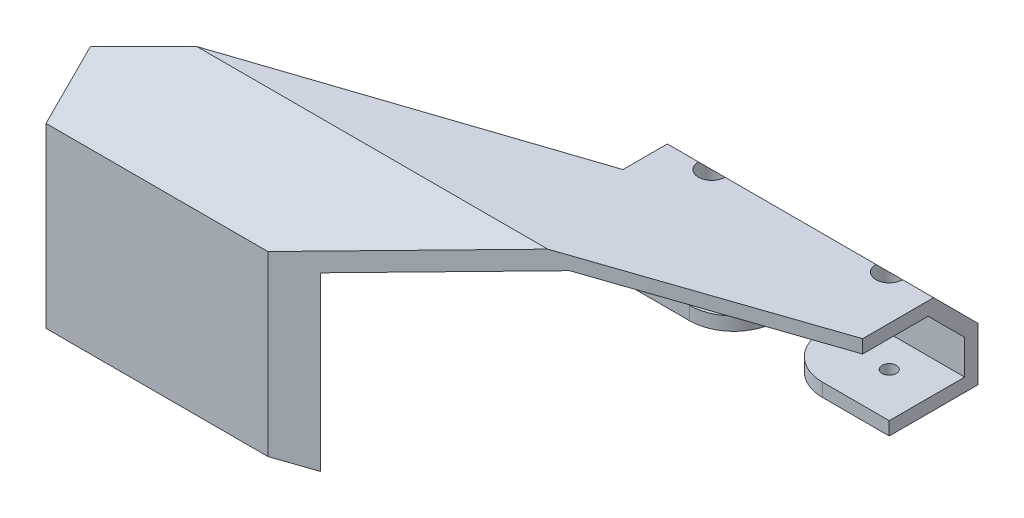
ISO-10303-21;
HEADER;
FILE_DESCRIPTION(('STEP AP214'),'2;1');
FILE_NAME('part.step','',(''),(''),'','','');
FILE_SCHEMA(('AUTOMOTIVE_DESIGN { 1 0 10303 214 1 1 1 1 }'));
ENDSEC;
DATA;
#1=APPLICATION_CONTEXT('core data for automotive mechanical design processes');
#2=APPLICATION_PROTOCOL_DEFINITION('international standard','automotive_design',2000,#1);
#3=PRODUCT_CONTEXT('',#1,'mechanical');
#4=PRODUCT('Part','Part','',(#3));
#5=PRODUCT_RELATED_PRODUCT_CATEGORY('part','',(#4));
#6=PRODUCT_DEFINITION_FORMATION('','',#4);
#7=PRODUCT_DEFINITION_CONTEXT('part definition',#1,'design');
#8=PRODUCT_DEFINITION('design','',#6,#7);
#9=PRODUCT_DEFINITION_SHAPE('','',#8);
#10=(LENGTH_UNIT() NAMED_UNIT(*) SI_UNIT(.MILLI.,.METRE.));
#11=(NAMED_UNIT(*) PLANE_ANGLE_UNIT() SI_UNIT($,.RADIAN.));
#12=(NAMED_UNIT(*) SI_UNIT($,.STERADIAN.) SOLID_ANGLE_UNIT());
#13=UNCERTAINTY_MEASURE_WITH_UNIT(LENGTH_MEASURE(1.E-05),#10,'distance_accuracy_value','');
#14=(GEOMETRIC_REPRESENTATION_CONTEXT(3) GLOBAL_UNCERTAINTY_ASSIGNED_CONTEXT((#13)) GLOBAL_UNIT_ASSIGNED_CONTEXT((#10,
#11,#12)) REPRESENTATION_CONTEXT('',''));
#15=CARTESIAN_POINT('',(0.,0.,0.));
#16=DIRECTION('',(0.,0.,1.));
#17=DIRECTION('',(1.,0.,0.));
#18=AXIS2_PLACEMENT_3D('',#15,#16,#17);
#19=CARTESIAN_POINT('',(-150.,3.,20.));
#20=DIRECTION('',(0.,0.,1.));
#21=DIRECTION('',(-1.,0.,0.));
#22=AXIS2_PLACEMENT_3D('',#19,#20,#21);
#23=PLANE('',#22);
#24=DIRECTION('',(1.,0.,0.));
#25=VECTOR('',#24,1.);
#26=CARTESIAN_POINT('',(-150.,3.,20.));
#27=LINE('',#26,#25);
#28=CARTESIAN_POINT('',(-60.,3.,20.));
#29=VERTEX_POINT('',#28);
#30=CARTESIAN_POINT('',(-45.,3.,20.));
#31=VERTEX_POINT('',#30);
#32=EDGE_CURVE('E386',#29,#31,#27,.T.);
#33=ORIENTED_EDGE('',*,*,#32,.F.);
#34=DIRECTION('',(0.,-1.,0.));
#35=VECTOR('',#34,1.);
#36=CARTESIAN_POINT('',(-60.,22.,20.));
#37=LINE('',#36,#35);
#38=CARTESIAN_POINT('',(-60.,0.,20.));
#39=VERTEX_POINT('',#38);
#40=EDGE_CURVE('E259',#29,#39,#37,.T.);
#41=ORIENTED_EDGE('',*,*,#40,.T.);
#42=DIRECTION('',(1.,0.,0.));
#43=VECTOR('',#42,1.);
#44=CARTESIAN_POINT('',(-150.,0.,20.));
#45=LINE('',#44,#43);
#46=CARTESIAN_POINT('',(-45.,0.,20.));
#47=VERTEX_POINT('',#46);
#48=EDGE_CURVE('E341',#39,#47,#45,.T.);
#49=ORIENTED_EDGE('',*,*,#48,.T.);
#50=DIRECTION('',(0.,-1.,0.));
#51=VECTOR('',#50,1.);
#52=CARTESIAN_POINT('',(-45.,0.,20.));
#53=LINE('',#52,#51);
#54=EDGE_CURVE('E391',#31,#47,#53,.T.);
#55=ORIENTED_EDGE('',*,*,#54,.F.);
#56=EDGE_LOOP('',(#33,#41,#49,#55));
#57=FACE_BOUND('',#56,.T.);
#58=ADVANCED_FACE('F35',(#57),#23,.T.);
#59=CARTESIAN_POINT('',(-150.,12.,0.));
#60=DIRECTION('',(0.,0.707106781186548,-0.707106781186548));
#61=DIRECTION('',(0.,-0.707106781186548,-0.707106781186548));
#62=AXIS2_PLACEMENT_3D('',#59,#60,#61);
#63=PLANE('',#62);
#64=DIRECTION('',(1.,0.,0.));
#65=VECTOR('',#64,1.);
#66=CARTESIAN_POINT('',(-150.,22.,10.));
#67=LINE('',#66,#65);
#68=CARTESIAN_POINT('',(-7.,22.,10.));
#69=VERTEX_POINT('',#68);
#70=CARTESIAN_POINT('',(0.,22.,10.));
#71=VERTEX_POINT('',#70);
#72=EDGE_CURVE('E356',#69,#71,#67,.T.);
#73=ORIENTED_EDGE('',*,*,#72,.T.);
#74=DIRECTION('',(0.,-0.707106781186548,-0.707106781186548));
#75=VECTOR('',#74,1.);
#76=CARTESIAN_POINT('',(0.,12.,0.));
#77=LINE('',#76,#75);
#78=CARTESIAN_POINT('',(0.,12.,0.));
#79=VERTEX_POINT('',#78);
#80=EDGE_CURVE('E335',#71,#79,#77,.T.);
#81=ORIENTED_EDGE('',*,*,#80,.T.);
#82=DIRECTION('',(1.,0.,0.));
#83=VECTOR('',#82,1.);
#84=CARTESIAN_POINT('',(-150.,12.,0.));
#85=LINE('',#84,#83);
#86=CARTESIAN_POINT('',(-60.,12.,0.));
#87=VERTEX_POINT('',#86);
#88=EDGE_CURVE('E349',#87,#79,#85,.T.);
#89=ORIENTED_EDGE('',*,*,#88,.F.);
#90=DIRECTION('',(0.,-0.707106781186548,-0.707106781186548));
#91=VECTOR('',#90,1.);
#92=CARTESIAN_POINT('',(-60.,12.,0.));
#93=LINE('',#92,#91);
#94=CARTESIAN_POINT('',(-60.,22.,10.));
#95=VERTEX_POINT('',#94);
#96=EDGE_CURVE('E278',#95,#87,#93,.T.);
#97=ORIENTED_EDGE('',*,*,#96,.F.);
#98=CARTESIAN_POINT('',(-53.,22.,10.));
#99=VERTEX_POINT('',#98);
#100=EDGE_CURVE('E352',#95,#99,#67,.T.);
#101=ORIENTED_EDGE('',*,*,#100,.T.);
#102=CARTESIAN_POINT('',(-50.,22.,10.));
#103=DIRECTION('',(0.,-0.707106781186548,0.707106781186548));
#104=DIRECTION('',(0.,-0.707106781186548,-0.707106781186548));
#105=AXIS2_PLACEMENT_3D('',#102,#103,#104);
#106=ELLIPSE('',#105,4.24264068711929,3.);
#107=CARTESIAN_POINT('',(-47.,22.,10.));
#108=VERTEX_POINT('',#107);
#109=EDGE_CURVE('E238',#108,#99,#106,.F.);
#110=ORIENTED_EDGE('',*,*,#109,.F.);
#111=CARTESIAN_POINT('',(-13.,22.,10.));
#112=VERTEX_POINT('',#111);
#113=EDGE_CURVE('E355',#108,#112,#67,.T.);
#114=ORIENTED_EDGE('',*,*,#113,.T.);
#115=CARTESIAN_POINT('',(-10.,22.,9.99999999999999));
#116=DIRECTION('',(0.,-0.707106781186548,0.707106781186548));
#117=DIRECTION('',(0.,-0.707106781186548,-0.707106781186548));
#118=AXIS2_PLACEMENT_3D('',#115,#116,#117);
#119=ELLIPSE('',#118,4.24264068711928,3.);
#120=EDGE_CURVE('E228',#69,#112,#119,.F.);
#121=ORIENTED_EDGE('',*,*,#120,.F.);
#122=EDGE_LOOP('',(#73,#81,#89,#97,#101,#110,#114,#121));
#123=FACE_BOUND('',#122,.T.);
#124=ADVANCED_FACE('F464',(#123),#63,.T.);
#125=CARTESIAN_POINT('',(-150.,22.,10.));
#126=DIRECTION('',(0.,1.,0.));
#127=DIRECTION('',(0.,0.,-1.));
#128=AXIS2_PLACEMENT_3D('',#125,#126,#127);
#129=PLANE('',#128);
#130=ORIENTED_EDGE('',*,*,#113,.F.);
#131=CARTESIAN_POINT('',(-50.,22.,10.));
#132=DIRECTION('',(0.,-1.,0.));
#133=DIRECTION('',(0.,0.,-1.));
#134=AXIS2_PLACEMENT_3D('',#131,#132,#133);
#135=CIRCLE('',#134,3.);
#136=EDGE_CURVE('E231',#108,#99,#135,.T.);
#137=ORIENTED_EDGE('',*,*,#136,.T.);
#138=ORIENTED_EDGE('',*,*,#100,.F.);
#139=DIRECTION('',(0.,0.,1.));
#140=VECTOR('',#139,1.);
#141=CARTESIAN_POINT('',(-60.,22.,0.));
#142=LINE('',#141,#140);
#143=CARTESIAN_POINT('',(-60.,22.,20.));
#144=VERTEX_POINT('',#143);
#145=EDGE_CURVE('E251',#95,#144,#142,.T.);
#146=ORIENTED_EDGE('',*,*,#145,.T.);
#147=DIRECTION('',(-0.948683298050514,0.,0.316227766016838));
#148=VECTOR('',#147,1.);
#149=CARTESIAN_POINT('',(-60.,22.,20.));
#150=LINE('',#149,#148);
#151=CARTESIAN_POINT('',(-132.,22.,44.));
#152=VERTEX_POINT('',#151);
#153=EDGE_CURVE('E256',#144,#152,#150,.T.);
#154=ORIENTED_EDGE('',*,*,#153,.T.);
#155=DIRECTION('',(1.,0.,0.));
#156=VECTOR('',#155,1.);
#157=CARTESIAN_POINT('',(-150.,22.,44.));
#158=LINE('',#157,#156);
#159=CARTESIAN_POINT('',(-52.9411764705882,22.,44.));
#160=VERTEX_POINT('',#159);
#161=EDGE_CURVE('E357',#152,#160,#158,.T.);
#162=ORIENTED_EDGE('',*,*,#161,.T.);
#163=DIRECTION('',(0.946772744819713,0.,-0.321902733238702));
#164=VECTOR('',#163,1.);
#165=CARTESIAN_POINT('',(-100.,22.,60.));
#166=LINE('',#165,#164);
#167=CARTESIAN_POINT('',(0.,22.,26.));
#168=VERTEX_POINT('',#167);
#169=EDGE_CURVE('E286',#160,#168,#166,.T.);
#170=ORIENTED_EDGE('',*,*,#169,.T.);
#171=DIRECTION('',(0.,0.,-1.));
#172=VECTOR('',#171,1.);
#173=CARTESIAN_POINT('',(0.,22.,10.));
#174=LINE('',#173,#172);
#175=EDGE_CURVE('E333',#168,#71,#174,.T.);
#176=ORIENTED_EDGE('',*,*,#175,.T.);
#177=ORIENTED_EDGE('',*,*,#72,.F.);
#178=CARTESIAN_POINT('',(-10.,22.,9.99999999999999));
#179=DIRECTION('',(0.,-1.,0.));
#180=DIRECTION('',(0.,0.,-1.));
#181=AXIS2_PLACEMENT_3D('',#178,#179,#180);
#182=CIRCLE('',#181,3.);
#183=EDGE_CURVE('E208',#69,#112,#182,.T.);
#184=ORIENTED_EDGE('',*,*,#183,.T.);
#185=EDGE_LOOP('',(#130,#137,#138,#146,#154,#162,#170,#176,#177,#184));
#186=FACE_BOUND('',#185,.T.);
#187=ADVANCED_FACE('F458',(#186),#129,.T.);
#188=CARTESIAN_POINT('',(-150.,22.,44.));
#189=DIRECTION('',(0.,0.707106781186548,0.707106781186548));
#190=DIRECTION('',(0.,0.707106781186548,-0.707106781186548));
#191=AXIS2_PLACEMENT_3D('',#188,#189,#190);
#192=PLANE('',#191);
#193=DIRECTION('',(0.,0.707106781186548,-0.707106781186548));
#194=VECTOR('',#193,1.);
#195=CARTESIAN_POINT('',(-150.,22.,44.));
#196=LINE('',#195,#194);
#197=CARTESIAN_POINT('',(-150.,6.,60.));
#198=VERTEX_POINT('',#197);
#199=CARTESIAN_POINT('',(-150.,16.,50.));
#200=VERTEX_POINT('',#199);
#201=EDGE_CURVE('E318',#198,#200,#196,.T.);
#202=ORIENTED_EDGE('',*,*,#201,.F.);
#203=DIRECTION('',(1.,0.,0.));
#204=VECTOR('',#203,1.);
#205=CARTESIAN_POINT('',(-150.,6.,60.));
#206=LINE('',#205,#204);
#207=CARTESIAN_POINT('',(-100.,6.,60.));
#208=VERTEX_POINT('',#207);
#209=EDGE_CURVE('E360',#198,#208,#206,.T.);
#210=ORIENTED_EDGE('',*,*,#209,.T.);
#211=DIRECTION('',(-0.901230117393125,-0.306418239913663,0.306418239913663));
#212=VECTOR('',#211,1.);
#213=CARTESIAN_POINT('',(-131.7738791423,-4.80311890838207,70.8031189083821));
#214=LINE('',#213,#212);
#215=EDGE_CURVE('E302',#160,#208,#214,.T.);
#216=ORIENTED_EDGE('',*,*,#215,.F.);
#217=ORIENTED_EDGE('',*,*,#161,.F.);
#218=DIRECTION('',(0.904534033733291,0.301511344577764,-0.301511344577764));
#219=VECTOR('',#218,1.);
#220=CARTESIAN_POINT('',(-146.727272727273,17.0909090909091,48.9090909090909));
#221=LINE('',#220,#219);
#222=EDGE_CURVE('E269',#200,#152,#221,.T.);
#223=ORIENTED_EDGE('',*,*,#222,.F.);
#224=EDGE_LOOP('',(#202,#210,#216,#217,#223));
#225=FACE_BOUND('',#224,.T.);
#226=ADVANCED_FACE('F454',(#225),#192,.T.);
#227=CARTESIAN_POINT('',(-150.,19.,42.7573593128807));
#228=DIRECTION('',(0.,-0.707106781186547,-0.707106781186548));
#229=DIRECTION('',(0.,-0.707106781186548,0.707106781186547));
#230=AXIS2_PLACEMENT_3D('',#227,#228,#229);
#231=PLANE('',#230);
#232=DIRECTION('',(1.,0.,0.));
#233=VECTOR('',#232,1.);
#234=CARTESIAN_POINT('',(-150.,19.,42.7573593128807));
#235=LINE('',#234,#233);
#236=CARTESIAN_POINT('',(-128.272077938642,19.,42.7573593128807));
#237=VERTEX_POINT('',#236);
#238=CARTESIAN_POINT('',(-49.2863509202374,19.,42.7573593128807));
#239=VERTEX_POINT('',#238);
#240=EDGE_CURVE('E372',#237,#239,#235,.T.);
#241=ORIENTED_EDGE('',*,*,#240,.T.);
#242=DIRECTION('',(0.901230117393125,0.306418239913663,-0.306418239913663));
#243=VECTOR('',#242,1.);
#244=CARTESIAN_POINT('',(-131.087560374236,-8.8124112143594,70.5697705272401));
#245=LINE('',#244,#243);
#246=CARTESIAN_POINT('',(-91.1764705882353,4.75735931288072,57.));
#247=VERTEX_POINT('',#246);
#248=EDGE_CURVE('E297',#247,#239,#245,.T.);
#249=ORIENTED_EDGE('',*,*,#248,.F.);
#250=DIRECTION('',(1.,0.,0.));
#251=VECTOR('',#250,1.);
#252=CARTESIAN_POINT('',(-150.,4.75735931288072,57.));
#253=LINE('',#252,#251);
#254=CARTESIAN_POINT('',(-150.,4.75735931288072,57.));
#255=VERTEX_POINT('',#254);
#256=EDGE_CURVE('E369',#255,#247,#253,.T.);
#257=ORIENTED_EDGE('',*,*,#256,.F.);
#258=DIRECTION('',(0.,-0.707106781186548,0.707106781186547));
#259=VECTOR('',#258,1.);
#260=CARTESIAN_POINT('',(-150.,19.,42.7573593128807));
#261=LINE('',#260,#259);
#262=CARTESIAN_POINT('',(-150.,11.7573593128807,50.));
#263=VERTEX_POINT('',#262);
#264=EDGE_CURVE('E306',#263,#255,#261,.T.);
#265=ORIENTED_EDGE('',*,*,#264,.F.);
#266=DIRECTION('',(-0.904534033733291,-0.301511344577764,0.301511344577764));
#267=VECTOR('',#266,1.);
#268=CARTESIAN_POINT('',(-146.049468716117,13.0742030741751,48.6831562387056));
#269=LINE('',#268,#267);
#270=EDGE_CURVE('E266',#237,#263,#269,.T.);
#271=ORIENTED_EDGE('',*,*,#270,.F.);
#272=EDGE_LOOP('',(#241,#249,#257,#265,#271));
#273=FACE_BOUND('',#272,.T.);
#274=ADVANCED_FACE('F445',(#273),#231,.T.);
#275=CARTESIAN_POINT('',(-150.,19.,11.2426406871193));
#276=DIRECTION('',(0.,-1.,0.));
#277=DIRECTION('',(0.,0.,1.));
#278=AXIS2_PLACEMENT_3D('',#275,#276,#277);
#279=PLANE('',#278);
#280=DIRECTION('',(1.,0.,0.));
#281=VECTOR('',#280,1.);
#282=CARTESIAN_POINT('',(-150.,19.,11.2426406871193));
#283=LINE('',#282,#281);
#284=CARTESIAN_POINT('',(-7.26946083662663,19.,11.2426406871193));
#285=VERTEX_POINT('',#284);
#286=CARTESIAN_POINT('',(0.,19.,11.2426406871193));
#287=VERTEX_POINT('',#286);
#288=EDGE_CURVE('E379',#285,#287,#283,.T.);
#289=ORIENTED_EDGE('',*,*,#288,.T.);
#290=DIRECTION('',(0.,0.,1.));
#291=VECTOR('',#290,1.);
#292=CARTESIAN_POINT('',(0.,19.,11.2426406871193));
#293=LINE('',#292,#291);
#294=CARTESIAN_POINT('',(0.,19.,26.));
#295=VERTEX_POINT('',#294);
#296=EDGE_CURVE('E330',#287,#295,#293,.T.);
#297=ORIENTED_EDGE('',*,*,#296,.T.);
#298=DIRECTION('',(0.946772744819713,0.,-0.321902733238702));
#299=VECTOR('',#298,1.);
#300=CARTESIAN_POINT('',(-129.959212830424,19.,70.186132362344));
#301=LINE('',#300,#299);
#302=EDGE_CURVE('E294',#239,#295,#301,.T.);
#303=ORIENTED_EDGE('',*,*,#302,.F.);
#304=ORIENTED_EDGE('',*,*,#240,.F.);
#305=DIRECTION('',(-0.948683298050514,0.,0.316227766016838));
#306=VECTOR('',#305,1.);
#307=CARTESIAN_POINT('',(-138.372792206136,19.,46.1242640687119));
#308=LINE('',#307,#306);
#309=CARTESIAN_POINT('',(-60.,19.,20.));
#310=VERTEX_POINT('',#309);
#311=EDGE_CURVE('E264',#310,#237,#308,.T.);
#312=ORIENTED_EDGE('',*,*,#311,.F.);
#313=DIRECTION('',(0.,0.,1.));
#314=VECTOR('',#313,1.);
#315=CARTESIAN_POINT('',(-60.,19.,11.2426406871193));
#316=LINE('',#315,#314);
#317=CARTESIAN_POINT('',(-60.,19.,11.2426406871193));
#318=VERTEX_POINT('',#317);
#319=EDGE_CURVE('E275',#318,#310,#316,.T.);
#320=ORIENTED_EDGE('',*,*,#319,.F.);
#321=CARTESIAN_POINT('',(-52.7305391633734,19.,11.2426406871193));
#322=VERTEX_POINT('',#321);
#323=EDGE_CURVE('E375',#318,#322,#283,.T.);
#324=ORIENTED_EDGE('',*,*,#323,.T.);
#325=CARTESIAN_POINT('',(-50.,19.,10.));
#326=DIRECTION('',(0.,1.,0.));
#327=DIRECTION('',(0.,0.,1.));
#328=AXIS2_PLACEMENT_3D('',#325,#326,#327);
#329=CIRCLE('',#328,3.);
#330=CARTESIAN_POINT('',(-47.2694608366266,19.,11.2426406871193));
#331=VERTEX_POINT('',#330);
#332=EDGE_CURVE('E235',#331,#322,#329,.F.);
#333=ORIENTED_EDGE('',*,*,#332,.F.);
#334=CARTESIAN_POINT('',(-12.7305391633734,19.,11.2426406871193));
#335=VERTEX_POINT('',#334);
#336=EDGE_CURVE('E378',#331,#335,#283,.T.);
#337=ORIENTED_EDGE('',*,*,#336,.T.);
#338=CARTESIAN_POINT('',(-10.,19.,9.99999999999999));
#339=DIRECTION('',(0.,1.,0.));
#340=DIRECTION('',(0.,0.,1.));
#341=AXIS2_PLACEMENT_3D('',#338,#339,#340);
#342=CIRCLE('',#341,3.);
#343=EDGE_CURVE('E225',#285,#335,#342,.F.);
#344=ORIENTED_EDGE('',*,*,#343,.F.);
#345=EDGE_LOOP('',(#289,#297,#303,#304,#312,#320,#324,#333,#337,#344));
#346=FACE_BOUND('',#345,.T.);
#347=ADVANCED_FACE('F437',(#346),#279,.T.);
#348=CARTESIAN_POINT('',(-15.,0.,20.));
#349=VERTEX_POINT('',#348);
#350=CARTESIAN_POINT('',(0.,0.,20.));
#351=VERTEX_POINT('',#350);
#352=EDGE_CURVE('E345',#349,#351,#45,.T.);
#353=ORIENTED_EDGE('',*,*,#352,.T.);
#354=DIRECTION('',(0.,1.,0.));
#355=VECTOR('',#354,1.);
#356=CARTESIAN_POINT('',(0.,3.,20.));
#357=LINE('',#356,#355);
#358=CARTESIAN_POINT('',(0.,3.,20.));
#359=VERTEX_POINT('',#358);
#360=EDGE_CURVE('E305',#351,#359,#357,.T.);
#361=ORIENTED_EDGE('',*,*,#360,.T.);
#362=CARTESIAN_POINT('',(-15.,3.,20.));
#363=VERTEX_POINT('',#362);
#364=EDGE_CURVE('E321',#363,#359,#27,.T.);
#365=ORIENTED_EDGE('',*,*,#364,.F.);
#366=DIRECTION('',(0.,-1.,0.));
#367=VECTOR('',#366,1.);
#368=CARTESIAN_POINT('',(-15.,3.,20.));
#369=LINE('',#368,#367);
#370=EDGE_CURVE('E11',#349,#363,#369,.F.);
#371=ORIENTED_EDGE('',*,*,#370,.F.);
#372=EDGE_LOOP('',(#353,#361,#365,#371));
#373=FACE_BOUND('',#372,.T.);
#374=ADVANCED_FACE('F418',(#373),#23,.T.);
#375=CARTESIAN_POINT('',(-150.,0.,20.));
#376=DIRECTION('',(0.,-1.,0.));
#377=DIRECTION('',(0.,0.,1.));
#378=AXIS2_PLACEMENT_3D('',#375,#376,#377);
#379=PLANE('',#378);
#380=ORIENTED_EDGE('',*,*,#48,.F.);
#381=DIRECTION('',(0.,0.,1.));
#382=VECTOR('',#381,1.);
#383=CARTESIAN_POINT('',(-60.,0.,20.));
#384=LINE('',#383,#382);
#385=CARTESIAN_POINT('',(-60.,0.,0.));
#386=VERTEX_POINT('',#385);
#387=EDGE_CURVE('E281',#386,#39,#384,.T.);
#388=ORIENTED_EDGE('',*,*,#387,.F.);
#389=DIRECTION('',(1.,0.,0.));
#390=VECTOR('',#389,1.);
#391=CARTESIAN_POINT('',(-150.,0.,0.));
#392=LINE('',#391,#390);
#393=CARTESIAN_POINT('',(0.,0.,0.));
#394=VERTEX_POINT('',#393);
#395=EDGE_CURVE('E346',#386,#394,#392,.T.);
#396=ORIENTED_EDGE('',*,*,#395,.T.);
#397=DIRECTION('',(0.,0.,1.));
#398=VECTOR('',#397,1.);
#399=CARTESIAN_POINT('',(0.,0.,20.));
#400=LINE('',#399,#398);
#401=EDGE_CURVE('E310',#394,#351,#400,.T.);
#402=ORIENTED_EDGE('',*,*,#401,.T.);
#403=ORIENTED_EDGE('',*,*,#352,.F.);
#404=CARTESIAN_POINT('',(-15.,0.,10.));
#405=DIRECTION('',(0.,1.,0.));
#406=DIRECTION('',(0.,0.,1.));
#407=AXIS2_PLACEMENT_3D('',#404,#405,#406);
#408=CIRCLE('',#407,10.);
#409=CARTESIAN_POINT('',(-25.,0.,10.));
#410=VERTEX_POINT('',#409);
#411=EDGE_CURVE('E56',#410,#349,#408,.T.);
#412=ORIENTED_EDGE('',*,*,#411,.F.);
#413=CARTESIAN_POINT('',(-30.,0.,10.));
#414=DIRECTION('',(0.,1.,0.));
#415=DIRECTION('',(0.,0.,1.));
#416=AXIS2_PLACEMENT_3D('',#413,#414,#415);
#417=CIRCLE('',#416,5.);
#418=CARTESIAN_POINT('',(-35.,0.,10.));
#419=VERTEX_POINT('',#418);
#420=EDGE_CURVE('E207',#410,#419,#417,.T.);
#421=ORIENTED_EDGE('',*,*,#420,.T.);
#422=CARTESIAN_POINT('',(-45.,0.,10.));
#423=DIRECTION('',(0.,1.,0.));
#424=DIRECTION('',(0.,0.,1.));
#425=AXIS2_PLACEMENT_3D('',#422,#423,#424);
#426=CIRCLE('',#425,10.);
#427=EDGE_CURVE('E212',#47,#419,#426,.T.);
#428=ORIENTED_EDGE('',*,*,#427,.F.);
#429=EDGE_LOOP('',(#380,#388,#396,#402,#403,#412,#421,#428));
#430=FACE_BOUND('',#429,.T.);
#431=CARTESIAN_POINT('',(-10.,0.,9.99999999999999));
#432=DIRECTION('',(0.,1.,0.));
#433=DIRECTION('',(0.,0.,1.));
#434=AXIS2_PLACEMENT_3D('',#431,#432,#433);
#435=CIRCLE('',#434,1.6);
#436=CARTESIAN_POINT('',(-10.,0.,11.6));
#437=VERTEX_POINT('',#436);
#438=EDGE_CURVE('E242',#437,#437,#435,.T.);
#439=ORIENTED_EDGE('',*,*,#438,.T.);
#440=EDGE_LOOP('',(#439));
#441=FACE_BOUND('',#440,.T.);
#442=CARTESIAN_POINT('',(-50.,0.,10.));
#443=DIRECTION('',(0.,1.,0.));
#444=DIRECTION('',(0.,0.,1.));
#445=AXIS2_PLACEMENT_3D('',#442,#443,#444);
#446=CIRCLE('',#445,1.6);
#447=CARTESIAN_POINT('',(-50.,0.,11.6));
#448=VERTEX_POINT('',#447);
#449=EDGE_CURVE('E248',#448,#448,#446,.T.);
#450=ORIENTED_EDGE('',*,*,#449,.T.);
#451=EDGE_LOOP('',(#450));
#452=FACE_BOUND('',#451,.T.);
#453=ADVANCED_FACE('F411',(#430,#441,#452),#379,.T.);
#454=CARTESIAN_POINT('',(-150.,0.,0.));
#455=DIRECTION('',(0.,0.,-1.));
#456=DIRECTION('',(1.,0.,0.));
#457=AXIS2_PLACEMENT_3D('',#454,#455,#456);
#458=PLANE('',#457);
#459=ORIENTED_EDGE('',*,*,#88,.T.);
#460=DIRECTION('',(0.,-1.,0.));
#461=VECTOR('',#460,1.);
#462=CARTESIAN_POINT('',(0.,0.,0.));
#463=LINE('',#462,#461);
#464=EDGE_CURVE('E338',#79,#394,#463,.T.);
#465=ORIENTED_EDGE('',*,*,#464,.T.);
#466=ORIENTED_EDGE('',*,*,#395,.F.);
#467=DIRECTION('',(0.,-1.,0.));
#468=VECTOR('',#467,1.);
#469=CARTESIAN_POINT('',(-60.,22.,0.));
#470=LINE('',#469,#468);
#471=EDGE_CURVE('E262',#87,#386,#470,.T.);
#472=ORIENTED_EDGE('',*,*,#471,.F.);
#473=EDGE_LOOP('',(#459,#465,#466,#472));
#474=FACE_BOUND('',#473,.T.);
#475=ADVANCED_FACE('F467',(#474),#458,.T.);
#476=CARTESIAN_POINT('',(-150.,10.7573593128807,3.));
#477=DIRECTION('',(0.,-0.707106781186547,0.707106781186548));
#478=DIRECTION('',(0.,0.707106781186548,0.707106781186547));
#479=AXIS2_PLACEMENT_3D('',#476,#477,#478);
#480=PLANE('',#479);
#481=ORIENTED_EDGE('',*,*,#336,.F.);
#482=CARTESIAN_POINT('',(-50.,17.7573593128807,10.));
#483=DIRECTION('',(0.,0.707106781186547,-0.707106781186548));
#484=DIRECTION('',(0.,-0.707106781186548,-0.707106781186547));
#485=AXIS2_PLACEMENT_3D('',#482,#483,#484);
#486=ELLIPSE('',#485,4.24264068711929,3.);
#487=EDGE_CURVE('E233',#322,#331,#486,.F.);
#488=ORIENTED_EDGE('',*,*,#487,.F.);
#489=ORIENTED_EDGE('',*,*,#323,.F.);
#490=DIRECTION('',(0.,0.707106781186548,0.707106781186547));
#491=VECTOR('',#490,1.);
#492=CARTESIAN_POINT('',(-60.,10.7573593128807,3.));
#493=LINE('',#492,#491);
#494=CARTESIAN_POINT('',(-60.,10.7573593128807,3.));
#495=VERTEX_POINT('',#494);
#496=EDGE_CURVE('E273',#495,#318,#493,.T.);
#497=ORIENTED_EDGE('',*,*,#496,.F.);
#498=DIRECTION('',(1.,0.,0.));
#499=VECTOR('',#498,1.);
#500=CARTESIAN_POINT('',(-150.,10.7573593128807,3.));
#501=LINE('',#500,#499);
#502=CARTESIAN_POINT('',(0.,10.7573593128807,3.));
#503=VERTEX_POINT('',#502);
#504=EDGE_CURVE('E380',#495,#503,#501,.T.);
#505=ORIENTED_EDGE('',*,*,#504,.T.);
#506=DIRECTION('',(0.,0.707106781186548,0.707106781186547));
#507=VECTOR('',#506,1.);
#508=CARTESIAN_POINT('',(0.,10.7573593128807,3.));
#509=LINE('',#508,#507);
#510=EDGE_CURVE('E328',#503,#287,#509,.T.);
#511=ORIENTED_EDGE('',*,*,#510,.T.);
#512=ORIENTED_EDGE('',*,*,#288,.F.);
#513=CARTESIAN_POINT('',(-10.,17.7573593128807,9.99999999999999));
#514=DIRECTION('',(0.,0.707106781186547,-0.707106781186548));
#515=DIRECTION('',(0.,-0.707106781186548,-0.707106781186547));
#516=AXIS2_PLACEMENT_3D('',#513,#514,#515);
#517=ELLIPSE('',#516,4.24264068711929,3.);
#518=EDGE_CURVE('E223',#335,#285,#517,.F.);
#519=ORIENTED_EDGE('',*,*,#518,.F.);
#520=EDGE_LOOP('',(#481,#488,#489,#497,#505,#511,#512,#519));
#521=FACE_BOUND('',#520,.T.);
#522=ADVANCED_FACE('F433',(#521),#480,.T.);
#523=CARTESIAN_POINT('',(-150.,3.,3.));
#524=DIRECTION('',(0.,0.,1.));
#525=DIRECTION('',(0.,1.,0.));
#526=AXIS2_PLACEMENT_3D('',#523,#524,#525);
#527=PLANE('',#526);
#528=DIRECTION('',(1.,0.,0.));
#529=VECTOR('',#528,1.);
#530=CARTESIAN_POINT('',(-150.,3.,3.));
#531=LINE('',#530,#529);
#532=CARTESIAN_POINT('',(-60.,3.,3.));
#533=VERTEX_POINT('',#532);
#534=CARTESIAN_POINT('',(0.,3.,3.));
#535=VERTEX_POINT('',#534);
#536=EDGE_CURVE('E383',#533,#535,#531,.T.);
#537=ORIENTED_EDGE('',*,*,#536,.T.);
#538=DIRECTION('',(0.,1.,0.));
#539=VECTOR('',#538,1.);
#540=CARTESIAN_POINT('',(0.,3.,3.));
#541=LINE('',#540,#539);
#542=EDGE_CURVE('E326',#535,#503,#541,.T.);
#543=ORIENTED_EDGE('',*,*,#542,.T.);
#544=ORIENTED_EDGE('',*,*,#504,.F.);
#545=DIRECTION('',(0.,1.,0.));
#546=VECTOR('',#545,1.);
#547=CARTESIAN_POINT('',(-60.,3.,3.));
#548=LINE('',#547,#546);
#549=EDGE_CURVE('E271',#533,#495,#548,.T.);
#550=ORIENTED_EDGE('',*,*,#549,.F.);
#551=EDGE_LOOP('',(#537,#543,#544,#550));
#552=FACE_BOUND('',#551,.T.);
#553=ADVANCED_FACE('F426',(#552),#527,.T.);
#554=CARTESIAN_POINT('',(-150.,3.,20.));
#555=DIRECTION('',(0.,1.,0.));
#556=DIRECTION('',(0.,0.,-1.));
#557=AXIS2_PLACEMENT_3D('',#554,#555,#556);
#558=PLANE('',#557);
#559=CARTESIAN_POINT('',(-30.,3.,10.));
#560=DIRECTION('',(0.,-1.,0.));
#561=DIRECTION('',(0.,0.,-1.));
#562=AXIS2_PLACEMENT_3D('',#559,#560,#561);
#563=CIRCLE('',#562,5.);
#564=CARTESIAN_POINT('',(-25.,3.,10.));
#565=VERTEX_POINT('',#564);
#566=CARTESIAN_POINT('',(-35.,3.,10.));
#567=VERTEX_POINT('',#566);
#568=EDGE_CURVE('E205',#565,#567,#563,.F.);
#569=ORIENTED_EDGE('',*,*,#568,.F.);
#570=CARTESIAN_POINT('',(-15.,3.,10.));
#571=DIRECTION('',(0.,-1.,0.));
#572=DIRECTION('',(0.,0.,-1.));
#573=AXIS2_PLACEMENT_3D('',#570,#571,#572);
#574=CIRCLE('',#573,10.);
#575=EDGE_CURVE('E50',#363,#565,#574,.T.);
#576=ORIENTED_EDGE('',*,*,#575,.F.);
#577=ORIENTED_EDGE('',*,*,#364,.T.);
#578=DIRECTION('',(0.,0.,-1.));
#579=VECTOR('',#578,1.);
#580=CARTESIAN_POINT('',(0.,3.,20.));
#581=LINE('',#580,#579);
#582=EDGE_CURVE('E324',#359,#535,#581,.T.);
#583=ORIENTED_EDGE('',*,*,#582,.T.);
#584=ORIENTED_EDGE('',*,*,#536,.F.);
#585=DIRECTION('',(0.,0.,-1.));
#586=VECTOR('',#585,1.);
#587=CARTESIAN_POINT('',(-60.,3.,20.));
#588=LINE('',#587,#586);
#589=EDGE_CURVE('E389',#29,#533,#588,.T.);
#590=ORIENTED_EDGE('',*,*,#589,.F.);
#591=ORIENTED_EDGE('',*,*,#32,.T.);
#592=CARTESIAN_POINT('',(-45.,3.,10.));
#593=DIRECTION('',(0.,-1.,0.));
#594=DIRECTION('',(0.,0.,-1.));
#595=AXIS2_PLACEMENT_3D('',#592,#593,#594);
#596=CIRCLE('',#595,10.);
#597=EDGE_CURVE('E43',#567,#31,#596,.T.);
#598=ORIENTED_EDGE('',*,*,#597,.F.);
#599=EDGE_LOOP('',(#569,#576,#577,#583,#584,#590,#591,#598));
#600=FACE_BOUND('',#599,.T.);
#601=CARTESIAN_POINT('',(-50.,3.,10.));
#602=DIRECTION('',(0.,-1.,0.));
#603=DIRECTION('',(0.,0.,-1.));
#604=AXIS2_PLACEMENT_3D('',#601,#602,#603);
#605=CIRCLE('',#604,1.6);
#606=CARTESIAN_POINT('',(-50.,3.,8.4));
#607=VERTEX_POINT('',#606);
#608=EDGE_CURVE('E245',#607,#607,#605,.F.);
#609=ORIENTED_EDGE('',*,*,#608,.F.);
#610=EDGE_LOOP('',(#609));
#611=FACE_BOUND('',#610,.T.);
#612=CARTESIAN_POINT('',(-10.,3.,9.99999999999999));
#613=DIRECTION('',(0.,-1.,0.));
#614=DIRECTION('',(0.,0.,-1.));
#615=AXIS2_PLACEMENT_3D('',#612,#613,#614);
#616=CIRCLE('',#615,1.6);
#617=CARTESIAN_POINT('',(-10.,3.,8.39999999999999));
#618=VERTEX_POINT('',#617);
#619=EDGE_CURVE('E241',#618,#618,#616,.F.);
#620=ORIENTED_EDGE('',*,*,#619,.F.);
#621=EDGE_LOOP('',(#620));
#622=FACE_BOUND('',#621,.T.);
#623=ADVANCED_FACE('F215',(#600,#611,#622),#558,.T.);
#624=CARTESIAN_POINT('',(-150.,0.,0.));
#625=DIRECTION('',(-1.,0.,0.));
#626=DIRECTION('',(0.,0.,-1.));
#627=AXIS2_PLACEMENT_3D('',#624,#625,#626);
#628=PLANE('',#627);
#629=ORIENTED_EDGE('',*,*,#264,.T.);
#630=DIRECTION('',(0.,-1.,0.));
#631=VECTOR('',#630,1.);
#632=CARTESIAN_POINT('',(-150.,4.75735931288072,57.));
#633=LINE('',#632,#631);
#634=CARTESIAN_POINT('',(-150.,-34.,57.));
#635=VERTEX_POINT('',#634);
#636=EDGE_CURVE('E309',#255,#635,#633,.T.);
#637=ORIENTED_EDGE('',*,*,#636,.T.);
#638=DIRECTION('',(0.,0.,1.));
#639=VECTOR('',#638,1.);
#640=CARTESIAN_POINT('',(-150.,-34.,57.));
#641=LINE('',#640,#639);
#642=CARTESIAN_POINT('',(-150.,-34.,60.));
#643=VERTEX_POINT('',#642);
#644=EDGE_CURVE('E313',#635,#643,#641,.T.);
#645=ORIENTED_EDGE('',*,*,#644,.T.);
#646=DIRECTION('',(0.,1.,0.));
#647=VECTOR('',#646,1.);
#648=CARTESIAN_POINT('',(-150.,6.,60.));
#649=LINE('',#648,#647);
#650=EDGE_CURVE('E316',#643,#198,#649,.T.);
#651=ORIENTED_EDGE('',*,*,#650,.T.);
#652=ORIENTED_EDGE('',*,*,#201,.T.);
#653=DIRECTION('',(0.,1.,0.));
#654=VECTOR('',#653,1.);
#655=CARTESIAN_POINT('',(-150.,0.,50.));
#656=LINE('',#655,#654);
#657=EDGE_CURVE('E344',#263,#200,#656,.T.);
#658=ORIENTED_EDGE('',*,*,#657,.F.);
#659=EDGE_LOOP('',(#629,#637,#645,#651,#652,#658));
#660=FACE_BOUND('',#659,.T.);
#661=ADVANCED_FACE('F449',(#660),#628,.T.);
#662=CARTESIAN_POINT('',(-150.,6.,60.));
#663=DIRECTION('',(0.,0.,1.));
#664=DIRECTION('',(0.,1.,0.));
#665=AXIS2_PLACEMENT_3D('',#662,#663,#664);
#666=PLANE('',#665);
#667=ORIENTED_EDGE('',*,*,#209,.F.);
#668=ORIENTED_EDGE('',*,*,#650,.F.);
#669=DIRECTION('',(1.,0.,0.));
#670=VECTOR('',#669,1.);
#671=CARTESIAN_POINT('',(-150.,-34.,60.));
#672=LINE('',#671,#670);
#673=CARTESIAN_POINT('',(-100.,-34.,60.));
#674=VERTEX_POINT('',#673);
#675=EDGE_CURVE('E363',#643,#674,#672,.T.);
#676=ORIENTED_EDGE('',*,*,#675,.T.);
#677=DIRECTION('',(0.,-1.,0.));
#678=VECTOR('',#677,1.);
#679=CARTESIAN_POINT('',(-100.,22.,60.));
#680=LINE('',#679,#678);
#681=EDGE_CURVE('E291',#208,#674,#680,.T.);
#682=ORIENTED_EDGE('',*,*,#681,.F.);
#683=EDGE_LOOP('',(#667,#668,#676,#682));
#684=FACE_BOUND('',#683,.T.);
#685=ADVANCED_FACE('F514',(#684),#666,.T.);
#686=CARTESIAN_POINT('',(-150.,-34.,57.));
#687=DIRECTION('',(0.,-1.,0.));
#688=DIRECTION('',(0.,0.,1.));
#689=AXIS2_PLACEMENT_3D('',#686,#687,#688);
#690=PLANE('',#689);
#691=ORIENTED_EDGE('',*,*,#675,.F.);
#692=ORIENTED_EDGE('',*,*,#644,.F.);
#693=DIRECTION('',(1.,0.,0.));
#694=VECTOR('',#693,1.);
#695=CARTESIAN_POINT('',(-150.,-34.,57.));
#696=LINE('',#695,#694);
#697=CARTESIAN_POINT('',(-91.1764705882353,-34.,57.));
#698=VERTEX_POINT('',#697);
#699=EDGE_CURVE('E366',#635,#698,#696,.T.);
#700=ORIENTED_EDGE('',*,*,#699,.T.);
#701=DIRECTION('',(0.946772744819713,0.,-0.321902733238702));
#702=VECTOR('',#701,1.);
#703=CARTESIAN_POINT('',(-100.,-34.,60.));
#704=LINE('',#703,#702);
#705=EDGE_CURVE('E283',#674,#698,#704,.T.);
#706=ORIENTED_EDGE('',*,*,#705,.F.);
#707=EDGE_LOOP('',(#691,#692,#700,#706));
#708=FACE_BOUND('',#707,.T.);
#709=ADVANCED_FACE('F519',(#708),#690,.T.);
#710=CARTESIAN_POINT('',(-150.,4.75735931288072,57.));
#711=DIRECTION('',(0.,0.,-1.));
#712=DIRECTION('',(0.,-1.,0.));
#713=AXIS2_PLACEMENT_3D('',#710,#711,#712);
#714=PLANE('',#713);
#715=ORIENTED_EDGE('',*,*,#699,.F.);
#716=ORIENTED_EDGE('',*,*,#636,.F.);
#717=ORIENTED_EDGE('',*,*,#256,.T.);
#718=DIRECTION('',(0.,1.,0.));
#719=VECTOR('',#718,1.);
#720=CARTESIAN_POINT('',(-91.1764705882353,4.75735931288069,57.));
#721=LINE('',#720,#719);
#722=EDGE_CURVE('E300',#698,#247,#721,.T.);
#723=ORIENTED_EDGE('',*,*,#722,.F.);
#724=EDGE_LOOP('',(#715,#716,#717,#723));
#725=FACE_BOUND('',#724,.T.);
#726=ADVANCED_FACE('F527',(#725),#714,.T.);
#727=CARTESIAN_POINT('',(0.,0.,0.));
#728=DIRECTION('',(-1.,0.,0.));
#729=DIRECTION('',(0.,0.,-1.));
#730=AXIS2_PLACEMENT_3D('',#727,#728,#729);
#731=PLANE('',#730);
#732=DIRECTION('',(0.,-1.,0.));
#733=VECTOR('',#732,1.);
#734=CARTESIAN_POINT('',(0.,22.,26.));
#735=LINE('',#734,#733);
#736=EDGE_CURVE('E289',#168,#295,#735,.T.);
#737=ORIENTED_EDGE('',*,*,#736,.T.);
#738=ORIENTED_EDGE('',*,*,#296,.F.);
#739=ORIENTED_EDGE('',*,*,#510,.F.);
#740=ORIENTED_EDGE('',*,*,#542,.F.);
#741=ORIENTED_EDGE('',*,*,#582,.F.);
#742=ORIENTED_EDGE('',*,*,#360,.F.);
#743=ORIENTED_EDGE('',*,*,#401,.F.);
#744=ORIENTED_EDGE('',*,*,#464,.F.);
#745=ORIENTED_EDGE('',*,*,#80,.F.);
#746=ORIENTED_EDGE('',*,*,#175,.F.);
#747=EDGE_LOOP('',(#737,#738,#739,#740,#741,#742,#743,#744,#745,#746));
#748=FACE_BOUND('',#747,.T.);
#749=ADVANCED_FACE('F422',(#748),#731,.F.);
#750=CARTESIAN_POINT('',(-100.,22.,60.));
#751=DIRECTION('',(0.321902733238702,0.,0.946772744819713));
#752=DIRECTION('',(-0.946772744819713,0.,0.321902733238702));
#753=AXIS2_PLACEMENT_3D('',#750,#751,#752);
#754=PLANE('',#753);
#755=ORIENTED_EDGE('',*,*,#169,.F.);
#756=ORIENTED_EDGE('',*,*,#215,.T.);
#757=ORIENTED_EDGE('',*,*,#681,.T.);
#758=ORIENTED_EDGE('',*,*,#705,.T.);
#759=ORIENTED_EDGE('',*,*,#722,.T.);
#760=ORIENTED_EDGE('',*,*,#248,.T.);
#761=ORIENTED_EDGE('',*,*,#302,.T.);
#762=ORIENTED_EDGE('',*,*,#736,.F.);
#763=EDGE_LOOP('',(#755,#756,#757,#758,#759,#760,#761,#762));
#764=FACE_BOUND('',#763,.T.);
#765=ADVANCED_FACE('F524',(#764),#754,.T.);
#766=CARTESIAN_POINT('',(-60.,22.,0.));
#767=DIRECTION('',(-1.,0.,0.));
#768=DIRECTION('',(0.,0.,-1.));
#769=AXIS2_PLACEMENT_3D('',#766,#767,#768);
#770=PLANE('',#769);
#771=ORIENTED_EDGE('',*,*,#471,.T.);
#772=ORIENTED_EDGE('',*,*,#387,.T.);
#773=ORIENTED_EDGE('',*,*,#40,.F.);
#774=ORIENTED_EDGE('',*,*,#589,.T.);
#775=ORIENTED_EDGE('',*,*,#549,.T.);
#776=ORIENTED_EDGE('',*,*,#496,.T.);
#777=ORIENTED_EDGE('',*,*,#319,.T.);
#778=EDGE_CURVE('E260',#144,#310,#37,.T.);
#779=ORIENTED_EDGE('',*,*,#778,.F.);
#780=ORIENTED_EDGE('',*,*,#145,.F.);
#781=ORIENTED_EDGE('',*,*,#96,.T.);
#782=EDGE_LOOP('',(#771,#772,#773,#774,#775,#776,#777,#779,#780,#781));
#783=FACE_BOUND('',#782,.T.);
#784=ADVANCED_FACE('F407',(#783),#770,.T.);
#785=CARTESIAN_POINT('',(-60.,22.,20.));
#786=DIRECTION('',(-0.316227766016838,0.,-0.948683298050514));
#787=DIRECTION('',(0.948683298050514,0.,-0.316227766016838));
#788=AXIS2_PLACEMENT_3D('',#785,#786,#787);
#789=PLANE('',#788);
#790=ORIENTED_EDGE('',*,*,#657,.T.);
#791=ORIENTED_EDGE('',*,*,#222,.T.);
#792=ORIENTED_EDGE('',*,*,#153,.F.);
#793=ORIENTED_EDGE('',*,*,#778,.T.);
#794=ORIENTED_EDGE('',*,*,#311,.T.);
#795=ORIENTED_EDGE('',*,*,#270,.T.);
#796=EDGE_LOOP('',(#790,#791,#792,#793,#794,#795));
#797=FACE_BOUND('',#796,.T.);
#798=ADVANCED_FACE('F441',(#797),#789,.T.);
#799=CARTESIAN_POINT('',(-50.,22.001,10.));
#800=DIRECTION('',(0.,-1.,0.));
#801=DIRECTION('',(0.,0.,1.));
#802=AXIS2_PLACEMENT_3D('',#799,#800,#801);
#803=CYLINDRICAL_SURFACE('',#802,1.6);
#804=ORIENTED_EDGE('',*,*,#608,.T.);
#805=EDGE_LOOP('',(#804));
#806=FACE_BOUND('',#805,.T.);
#807=ORIENTED_EDGE('',*,*,#449,.F.);
#808=EDGE_LOOP('',(#807));
#809=FACE_BOUND('',#808,.T.);
#810=ADVANCED_FACE('F556',(#806,#809),#803,.F.);
#811=CARTESIAN_POINT('',(-10.,22.001,9.99999999999999));
#812=DIRECTION('',(0.,-1.,0.));
#813=DIRECTION('',(0.,0.,1.));
#814=AXIS2_PLACEMENT_3D('',#811,#812,#813);
#815=CYLINDRICAL_SURFACE('',#814,1.6);
#816=ORIENTED_EDGE('',*,*,#619,.T.);
#817=EDGE_LOOP('',(#816));
#818=FACE_BOUND('',#817,.T.);
#819=ORIENTED_EDGE('',*,*,#438,.F.);
#820=EDGE_LOOP('',(#819));
#821=FACE_BOUND('',#820,.T.);
#822=ADVANCED_FACE('F484',(#818,#821),#815,.F.);
#823=CARTESIAN_POINT('',(-50.,22.,10.));
#824=DIRECTION('',(0.,-1.,0.));
#825=DIRECTION('',(0.,0.,1.));
#826=AXIS2_PLACEMENT_3D('',#823,#824,#825);
#827=CYLINDRICAL_SURFACE('',#826,3.);
#828=ORIENTED_EDGE('',*,*,#487,.T.);
#829=ORIENTED_EDGE('',*,*,#332,.T.);
#830=EDGE_LOOP('',(#828,#829));
#831=FACE_BOUND('',#830,.T.);
#832=ORIENTED_EDGE('',*,*,#136,.F.);
#833=ORIENTED_EDGE('',*,*,#109,.T.);
#834=EDGE_LOOP('',(#832,#833));
#835=FACE_BOUND('',#834,.T.);
#836=ADVANCED_FACE('F476',(#831,#835),#827,.F.);
#837=CARTESIAN_POINT('',(-10.,22.,9.99999999999999));
#838=DIRECTION('',(0.,-1.,0.));
#839=DIRECTION('',(0.,0.,1.));
#840=AXIS2_PLACEMENT_3D('',#837,#838,#839);
#841=CYLINDRICAL_SURFACE('',#840,3.);
#842=ORIENTED_EDGE('',*,*,#518,.T.);
#843=ORIENTED_EDGE('',*,*,#343,.T.);
#844=EDGE_LOOP('',(#842,#843));
#845=FACE_BOUND('',#844,.T.);
#846=ORIENTED_EDGE('',*,*,#183,.F.);
#847=ORIENTED_EDGE('',*,*,#120,.T.);
#848=EDGE_LOOP('',(#846,#847));
#849=FACE_BOUND('',#848,.T.);
#850=ADVANCED_FACE('F474',(#845,#849),#841,.F.);
#851=CARTESIAN_POINT('',(-30.,22.001,10.));
#852=DIRECTION('',(0.,-1.,0.));
#853=DIRECTION('',(0.,0.,1.));
#854=AXIS2_PLACEMENT_3D('',#851,#852,#853);
#855=CYLINDRICAL_SURFACE('',#854,5.);
#856=DIRECTION('',(0.,-1.,0.));
#857=VECTOR('',#856,1.);
#858=CARTESIAN_POINT('',(-25.,22.001,10.));
#859=LINE('',#858,#857);
#860=EDGE_CURVE('E203',#565,#410,#859,.T.);
#861=ORIENTED_EDGE('',*,*,#860,.F.);
#862=ORIENTED_EDGE('',*,*,#568,.T.);
#863=DIRECTION('',(0.,-1.,0.));
#864=VECTOR('',#863,1.);
#865=CARTESIAN_POINT('',(-35.,22.001,10.));
#866=LINE('',#865,#864);
#867=EDGE_CURVE('E209',#567,#419,#866,.T.);
#868=ORIENTED_EDGE('',*,*,#867,.T.);
#869=ORIENTED_EDGE('',*,*,#420,.F.);
#870=EDGE_LOOP('',(#861,#862,#868,#869));
#871=FACE_BOUND('',#870,.T.);
#872=ADVANCED_FACE('F204',(#871),#855,.F.);
#873=CARTESIAN_POINT('',(-45.,3.,10.));
#874=DIRECTION('',(0.,1.,0.));
#875=DIRECTION('',(0.,0.,-1.));
#876=AXIS2_PLACEMENT_3D('',#873,#874,#875);
#877=CYLINDRICAL_SURFACE('',#876,10.);
#878=ORIENTED_EDGE('',*,*,#597,.T.);
#879=ORIENTED_EDGE('',*,*,#54,.T.);
#880=ORIENTED_EDGE('',*,*,#427,.T.);
#881=ORIENTED_EDGE('',*,*,#867,.F.);
#882=EDGE_LOOP('',(#878,#879,#880,#881));
#883=FACE_BOUND('',#882,.T.);
#884=ADVANCED_FACE('F398',(#883),#877,.T.);
#885=CARTESIAN_POINT('',(-15.,22.001,10.));
#886=DIRECTION('',(0.,1.,0.));
#887=DIRECTION('',(0.,0.,-1.));
#888=AXIS2_PLACEMENT_3D('',#885,#886,#887);
#889=CYLINDRICAL_SURFACE('',#888,10.);
#890=ORIENTED_EDGE('',*,*,#575,.T.);
#891=ORIENTED_EDGE('',*,*,#860,.T.);
#892=ORIENTED_EDGE('',*,*,#411,.T.);
#893=ORIENTED_EDGE('',*,*,#370,.T.);
#894=EDGE_LOOP('',(#890,#891,#892,#893));
#895=FACE_BOUND('',#894,.T.);
#896=ADVANCED_FACE('F37',(#895),#889,.T.);
#897=CLOSED_SHELL('',(#58,#124,#187,#226,#274,#347,#374,#453,#475,#522,#553,#623,#661,#685,#709,
#726,#749,#765,#784,#798,#810,#822,#836,#850,#872,#884,#896));
#898=MANIFOLD_SOLID_BREP('B2',#897);
#899=ADVANCED_BREP_SHAPE_REPRESENTATION('',(#18,#898),#14);
#900=SHAPE_DEFINITION_REPRESENTATION(#9,#899);
ENDSEC;
END-ISO-10303-21;
